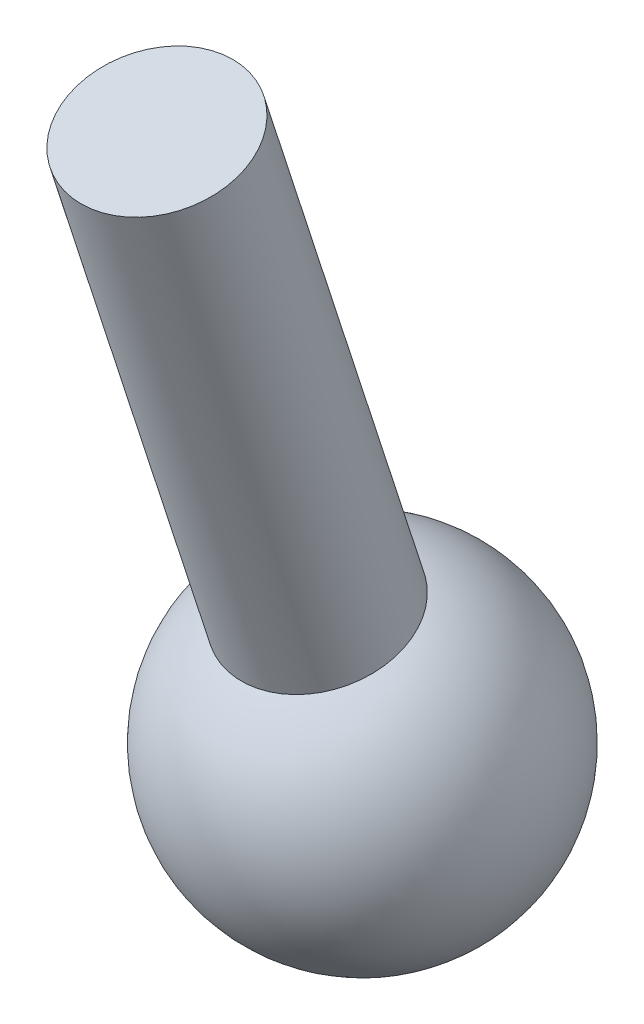
ISO-10303-21;
HEADER;
FILE_DESCRIPTION(('STEP AP214'),'2;1');
FILE_NAME('part.step','',(''),(''),'','','');
FILE_SCHEMA(('AUTOMOTIVE_DESIGN { 1 0 10303 214 1 1 1 1 }'));
ENDSEC;
DATA;
#1=APPLICATION_CONTEXT('core data for automotive mechanical design processes');
#2=APPLICATION_PROTOCOL_DEFINITION('international standard','automotive_design',2000,#1);
#3=PRODUCT_CONTEXT('',#1,'mechanical');
#4=PRODUCT('Part','Part','',(#3));
#5=PRODUCT_RELATED_PRODUCT_CATEGORY('part','',(#4));
#6=PRODUCT_DEFINITION_FORMATION('','',#4);
#7=PRODUCT_DEFINITION_CONTEXT('part definition',#1,'design');
#8=PRODUCT_DEFINITION('design','',#6,#7);
#9=PRODUCT_DEFINITION_SHAPE('','',#8);
#10=(LENGTH_UNIT() NAMED_UNIT(*) SI_UNIT(.MILLI.,.METRE.));
#11=(NAMED_UNIT(*) PLANE_ANGLE_UNIT() SI_UNIT($,.RADIAN.));
#12=(NAMED_UNIT(*) SI_UNIT($,.STERADIAN.) SOLID_ANGLE_UNIT());
#13=UNCERTAINTY_MEASURE_WITH_UNIT(LENGTH_MEASURE(1.E-05),#10,'distance_accuracy_value','');
#14=(GEOMETRIC_REPRESENTATION_CONTEXT(3) GLOBAL_UNCERTAINTY_ASSIGNED_CONTEXT((#13)) GLOBAL_UNIT_ASSIGNED_CONTEXT((#10,
#11,#12)) REPRESENTATION_CONTEXT('',''));
#15=CARTESIAN_POINT('',(0.,0.,0.));
#16=DIRECTION('',(0.,0.,1.));
#17=DIRECTION('',(1.,0.,0.));
#18=AXIS2_PLACEMENT_3D('',#15,#16,#17);
#19=CARTESIAN_POINT('',(178.94147151858,-327.445206803369,606.506524701873));
#20=DIRECTION('',(0.,-0.30901699437495,0.951056516295153));
#21=DIRECTION('',(-1.,0.,0.));
#22=AXIS2_PLACEMENT_3D('',#19,#20,#21);
#23=SPHERICAL_SURFACE('',#22,12.5);
#24=CARTESIAN_POINT('',(178.94147151858,-327.445206803369,606.506524701873));
#25=DIRECTION('',(0.,-0.951056516295152,-0.309016994374953));
#26=DIRECTION('',(0.,0.309016994374953,-0.951056516295152));
#27=AXIS2_PLACEMENT_3D('',#24,#25,#26);
#28=SPHERICAL_SURFACE('',#27,12.5);
#29=CARTESIAN_POINT('',(178.94147151858,-317.016057902965,609.89516059456));
#30=DIRECTION('',(0.,-0.951056516295151,-0.309016994374953));
#31=DIRECTION('',(0.,0.309016994374953,-0.951056516295152));
#32=AXIS2_PLACEMENT_3D('',#29,#30,#31);
#33=CIRCLE('',#32,5.99999999999997);
#34=CARTESIAN_POINT('',(178.94147151858,-315.161955936716,604.188821496789));
#35=VERTEX_POINT('',#34);
#36=EDGE_CURVE('E10',#35,#35,#33,.F.);
#37=ORIENTED_EDGE('',*,*,#36,.F.);
#38=EDGE_LOOP('',(#37));
#39=FACE_BOUND('',#38,.T.);
#40=ADVANCED_FACE('F37',(#39),#28,.T.);
#41=CARTESIAN_POINT('',(178.94147151858,-279.892380988612,621.95737442062));
#42=DIRECTION('',(0.,-0.951056516295153,-0.30901699437495));
#43=DIRECTION('',(0.,0.30901699437495,-0.951056516295153));
#44=AXIS2_PLACEMENT_3D('',#41,#42,#43);
#45=CYLINDRICAL_SURFACE('',#44,5.99999999999997);
#46=CARTESIAN_POINT('',(178.94147151858,-279.892380988612,621.95737442062));
#47=DIRECTION('',(0.,0.951056516295153,0.30901699437495));
#48=DIRECTION('',(0.,-0.30901699437495,0.951056516295153));
#49=AXIS2_PLACEMENT_3D('',#46,#47,#48);
#50=CIRCLE('',#49,5.99999999999997);
#51=CARTESIAN_POINT('',(178.94147151858,-281.746482954861,627.663713518391));
#52=VERTEX_POINT('',#51);
#53=EDGE_CURVE('E43',#52,#52,#50,.T.);
#54=ORIENTED_EDGE('',*,*,#53,.F.);
#55=EDGE_LOOP('',(#54));
#56=FACE_BOUND('',#55,.T.);
#57=ORIENTED_EDGE('',*,*,#36,.T.);
#58=EDGE_LOOP('',(#57));
#59=FACE_BOUND('',#58,.T.);
#60=ADVANCED_FACE('F51',(#56,#59),#45,.T.);
#61=CARTESIAN_POINT('',(178.94147151858,-279.892380988612,621.95737442062));
#62=DIRECTION('',(0.,0.951056516295153,0.30901699437495));
#63=DIRECTION('',(0.,-0.30901699437495,0.951056516295153));
#64=AXIS2_PLACEMENT_3D('',#61,#62,#63);
#65=PLANE('',#64);
#66=ORIENTED_EDGE('',*,*,#53,.T.);
#67=EDGE_LOOP('',(#66));
#68=FACE_BOUND('',#67,.T.);
#69=ADVANCED_FACE('F49',(#68),#65,.T.);
#70=CLOSED_SHELL('',(#40,#60,#69));
#71=MANIFOLD_SOLID_BREP('B2',#70);
#72=ADVANCED_BREP_SHAPE_REPRESENTATION('',(#18,#71),#14);
#73=SHAPE_DEFINITION_REPRESENTATION(#9,#72);
ENDSEC;
END-ISO-10303-21;
